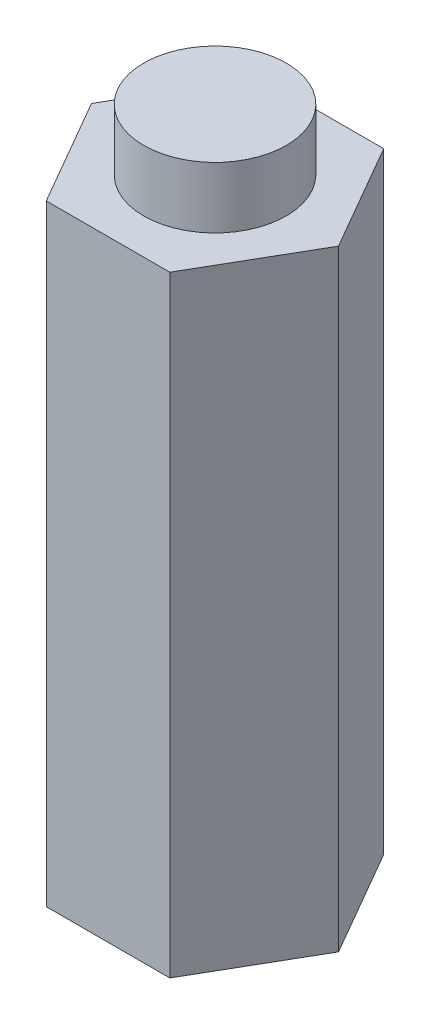
ISO-10303-21;
HEADER;
FILE_DESCRIPTION(('STEP AP214'),'2;1');
FILE_NAME('part.step','',(''),(''),'','','');
FILE_SCHEMA(('AUTOMOTIVE_DESIGN { 1 0 10303 214 1 1 1 1 }'));
ENDSEC;
DATA;
#1=APPLICATION_CONTEXT('core data for automotive mechanical design processes');
#2=APPLICATION_PROTOCOL_DEFINITION('international standard','automotive_design',2000,#1);
#3=PRODUCT_CONTEXT('',#1,'mechanical');
#4=PRODUCT('Part','Part','',(#3));
#5=PRODUCT_RELATED_PRODUCT_CATEGORY('part','',(#4));
#6=PRODUCT_DEFINITION_FORMATION('','',#4);
#7=PRODUCT_DEFINITION_CONTEXT('part definition',#1,'design');
#8=PRODUCT_DEFINITION('design','',#6,#7);
#9=PRODUCT_DEFINITION_SHAPE('','',#8);
#10=(LENGTH_UNIT() NAMED_UNIT(*) SI_UNIT(.MILLI.,.METRE.));
#11=(NAMED_UNIT(*) PLANE_ANGLE_UNIT() SI_UNIT($,.RADIAN.));
#12=(NAMED_UNIT(*) SI_UNIT($,.STERADIAN.) SOLID_ANGLE_UNIT());
#13=UNCERTAINTY_MEASURE_WITH_UNIT(LENGTH_MEASURE(1.E-05),#10,'distance_accuracy_value','');
#14=(GEOMETRIC_REPRESENTATION_CONTEXT(3) GLOBAL_UNCERTAINTY_ASSIGNED_CONTEXT((#13)) GLOBAL_UNIT_ASSIGNED_CONTEXT((#10,
#11,#12)) REPRESENTATION_CONTEXT('',''));
#15=CARTESIAN_POINT('',(0.,0.,0.));
#16=DIRECTION('',(0.,0.,1.));
#17=DIRECTION('',(1.,0.,0.));
#18=AXIS2_PLACEMENT_3D('',#15,#16,#17);
#19=CARTESIAN_POINT('',(0.,60.,0.));
#20=DIRECTION('',(0.,1.,0.));
#21=DIRECTION('',(0.,0.,1.));
#22=AXIS2_PLACEMENT_3D('',#19,#20,#21);
#23=PLANE('',#22);
#24=DIRECTION('',(0.499999999999995,0.,-0.866025403784441));
#25=VECTOR('',#24,1.);
#26=CARTESIAN_POINT('',(6.06217782649116,60.,10.4999999999999));
#27=LINE('',#26,#25);
#28=CARTESIAN_POINT('',(6.06217782649116,60.,10.4999999999999));
#29=VERTEX_POINT('',#28);
#30=CARTESIAN_POINT('',(12.1243556529821,60.,0.));
#31=VERTEX_POINT('',#30);
#32=EDGE_CURVE('E133',#29,#31,#27,.T.);
#33=ORIENTED_EDGE('',*,*,#32,.T.);
#34=DIRECTION('',(-0.500000000000001,0.,-0.866025403784438));
#35=VECTOR('',#34,1.);
#36=CARTESIAN_POINT('',(12.1243556529821,60.,0.));
#37=LINE('',#36,#35);
#38=CARTESIAN_POINT('',(6.06217782649102,60.,-10.5));
#39=VERTEX_POINT('',#38);
#40=EDGE_CURVE('E91',#31,#39,#37,.T.);
#41=ORIENTED_EDGE('',*,*,#40,.T.);
#42=DIRECTION('',(-1.,0.,0.));
#43=VECTOR('',#42,1.);
#44=CARTESIAN_POINT('',(6.06217782649102,60.,-10.5));
#45=LINE('',#44,#43);
#46=CARTESIAN_POINT('',(-6.06217782649109,60.,-10.4999999999999));
#47=VERTEX_POINT('',#46);
#48=EDGE_CURVE('E106',#39,#47,#45,.T.);
#49=ORIENTED_EDGE('',*,*,#48,.T.);
#50=DIRECTION('',(-0.499999999999995,0.,0.866025403784442));
#51=VECTOR('',#50,1.);
#52=CARTESIAN_POINT('',(-6.06217782649109,60.,-10.4999999999999));
#53=LINE('',#52,#51);
#54=CARTESIAN_POINT('',(-12.1243556529821,60.,0.));
#55=VERTEX_POINT('',#54);
#56=EDGE_CURVE('E99',#47,#55,#53,.T.);
#57=ORIENTED_EDGE('',*,*,#56,.T.);
#58=DIRECTION('',(0.500000000000007,0.,0.866025403784435));
#59=VECTOR('',#58,1.);
#60=CARTESIAN_POINT('',(-12.1243556529821,60.,0.));
#61=LINE('',#60,#59);
#62=CARTESIAN_POINT('',(-6.06217782649094,60.,10.5));
#63=VERTEX_POINT('',#62);
#64=EDGE_CURVE('E102',#55,#63,#61,.T.);
#65=ORIENTED_EDGE('',*,*,#64,.T.);
#66=DIRECTION('',(1.,0.,0.));
#67=VECTOR('',#66,1.);
#68=CARTESIAN_POINT('',(-6.06217782649094,60.,10.5));
#69=LINE('',#68,#67);
#70=EDGE_CURVE('E57',#63,#29,#69,.T.);
#71=ORIENTED_EDGE('',*,*,#70,.T.);
#72=EDGE_LOOP('',(#33,#41,#49,#57,#65,#71));
#73=FACE_BOUND('',#72,.T.);
#74=CARTESIAN_POINT('',(0.,60.,0.));
#75=DIRECTION('',(0.,1.,0.));
#76=DIRECTION('',(0.,0.,1.));
#77=AXIS2_PLACEMENT_3D('',#74,#75,#76);
#78=CIRCLE('',#77,7.);
#79=CARTESIAN_POINT('',(0.,60.,7.));
#80=VERTEX_POINT('',#79);
#81=EDGE_CURVE('E126',#80,#80,#78,.T.);
#82=ORIENTED_EDGE('',*,*,#81,.F.);
#83=EDGE_LOOP('',(#82));
#84=FACE_BOUND('',#83,.T.);
#85=ADVANCED_FACE('F39',(#73,#84),#23,.T.);
#86=CARTESIAN_POINT('',(0.,0.,0.));
#87=DIRECTION('',(0.,1.,0.));
#88=DIRECTION('',(0.,0.,1.));
#89=AXIS2_PLACEMENT_3D('',#86,#87,#88);
#90=PLANE('',#89);
#91=DIRECTION('',(0.499999999999995,0.,-0.866025403784441));
#92=VECTOR('',#91,1.);
#93=CARTESIAN_POINT('',(6.06217782649116,0.,10.4999999999999));
#94=LINE('',#93,#92);
#95=CARTESIAN_POINT('',(6.06217782649116,0.,10.4999999999999));
#96=VERTEX_POINT('',#95);
#97=CARTESIAN_POINT('',(12.1243556529821,0.,0.));
#98=VERTEX_POINT('',#97);
#99=EDGE_CURVE('E122',#96,#98,#94,.T.);
#100=ORIENTED_EDGE('',*,*,#99,.F.);
#101=DIRECTION('',(1.,0.,0.));
#102=VECTOR('',#101,1.);
#103=CARTESIAN_POINT('',(-6.06217782649094,0.,10.5));
#104=LINE('',#103,#102);
#105=CARTESIAN_POINT('',(-6.06217782649094,0.,10.5));
#106=VERTEX_POINT('',#105);
#107=EDGE_CURVE('E84',#106,#96,#104,.T.);
#108=ORIENTED_EDGE('',*,*,#107,.F.);
#109=DIRECTION('',(0.500000000000007,0.,0.866025403784435));
#110=VECTOR('',#109,1.);
#111=CARTESIAN_POINT('',(-12.1243556529821,0.,0.));
#112=LINE('',#111,#110);
#113=CARTESIAN_POINT('',(-12.1243556529821,0.,0.));
#114=VERTEX_POINT('',#113);
#115=EDGE_CURVE('E76',#114,#106,#112,.T.);
#116=ORIENTED_EDGE('',*,*,#115,.F.);
#117=DIRECTION('',(-0.499999999999995,0.,0.866025403784442));
#118=VECTOR('',#117,1.);
#119=CARTESIAN_POINT('',(-6.06217782649109,0.,-10.4999999999999));
#120=LINE('',#119,#118);
#121=CARTESIAN_POINT('',(-6.06217782649109,0.,-10.4999999999999));
#122=VERTEX_POINT('',#121);
#123=EDGE_CURVE('E111',#122,#114,#120,.T.);
#124=ORIENTED_EDGE('',*,*,#123,.F.);
#125=DIRECTION('',(-1.,0.,0.));
#126=VECTOR('',#125,1.);
#127=CARTESIAN_POINT('',(6.06217782649102,0.,-10.5));
#128=LINE('',#127,#126);
#129=CARTESIAN_POINT('',(6.06217782649102,0.,-10.5));
#130=VERTEX_POINT('',#129);
#131=EDGE_CURVE('E128',#130,#122,#128,.T.);
#132=ORIENTED_EDGE('',*,*,#131,.F.);
#133=DIRECTION('',(-0.500000000000001,0.,-0.866025403784438));
#134=VECTOR('',#133,1.);
#135=CARTESIAN_POINT('',(12.1243556529821,0.,0.));
#136=LINE('',#135,#134);
#137=EDGE_CURVE('E130',#98,#130,#136,.T.);
#138=ORIENTED_EDGE('',*,*,#137,.F.);
#139=EDGE_LOOP('',(#100,#108,#116,#124,#132,#138));
#140=FACE_BOUND('',#139,.T.);
#141=ADVANCED_FACE('F145',(#140),#90,.F.);
#142=CARTESIAN_POINT('',(6.06217782649116,60.,10.4999999999999));
#143=DIRECTION('',(-0.866025403784441,0.,-0.499999999999995));
#144=DIRECTION('',(-0.499999999999995,0.,0.866025403784442));
#145=AXIS2_PLACEMENT_3D('',#142,#143,#144);
#146=PLANE('',#145);
#147=ORIENTED_EDGE('',*,*,#99,.T.);
#148=DIRECTION('',(0.,-1.,0.));
#149=VECTOR('',#148,1.);
#150=CARTESIAN_POINT('',(12.1243556529821,60.,0.));
#151=LINE('',#150,#149);
#152=EDGE_CURVE('E11',#31,#98,#151,.T.);
#153=ORIENTED_EDGE('',*,*,#152,.F.);
#154=ORIENTED_EDGE('',*,*,#32,.F.);
#155=DIRECTION('',(0.,-1.,0.));
#156=VECTOR('',#155,1.);
#157=CARTESIAN_POINT('',(6.06217782649116,60.,10.4999999999999));
#158=LINE('',#157,#156);
#159=EDGE_CURVE('E118',#29,#96,#158,.T.);
#160=ORIENTED_EDGE('',*,*,#159,.T.);
#161=EDGE_LOOP('',(#147,#153,#154,#160));
#162=FACE_BOUND('',#161,.T.);
#163=ADVANCED_FACE('F41',(#162),#146,.F.);
#164=CARTESIAN_POINT('',(12.1243556529821,60.,0.));
#165=DIRECTION('',(-0.866025403784438,0.,0.500000000000001));
#166=DIRECTION('',(0.500000000000001,0.,0.866025403784438));
#167=AXIS2_PLACEMENT_3D('',#164,#165,#166);
#168=PLANE('',#167);
#169=ORIENTED_EDGE('',*,*,#137,.T.);
#170=DIRECTION('',(0.,-1.,0.));
#171=VECTOR('',#170,1.);
#172=CARTESIAN_POINT('',(6.06217782649102,60.,-10.5));
#173=LINE('',#172,#171);
#174=EDGE_CURVE('E48',#39,#130,#173,.T.);
#175=ORIENTED_EDGE('',*,*,#174,.F.);
#176=ORIENTED_EDGE('',*,*,#40,.F.);
#177=ORIENTED_EDGE('',*,*,#152,.T.);
#178=EDGE_LOOP('',(#169,#175,#176,#177));
#179=FACE_BOUND('',#178,.T.);
#180=ADVANCED_FACE('F224',(#179),#168,.F.);
#181=CARTESIAN_POINT('',(6.06217782649102,60.,-10.5));
#182=DIRECTION('',(0.,0.,1.));
#183=DIRECTION('',(1.,0.,0.));
#184=AXIS2_PLACEMENT_3D('',#181,#182,#183);
#185=PLANE('',#184);
#186=ORIENTED_EDGE('',*,*,#131,.T.);
#187=DIRECTION('',(0.,-1.,0.));
#188=VECTOR('',#187,1.);
#189=CARTESIAN_POINT('',(-6.06217782649109,60.,-10.4999999999999));
#190=LINE('',#189,#188);
#191=EDGE_CURVE('E113',#47,#122,#190,.T.);
#192=ORIENTED_EDGE('',*,*,#191,.F.);
#193=ORIENTED_EDGE('',*,*,#48,.F.);
#194=ORIENTED_EDGE('',*,*,#174,.T.);
#195=EDGE_LOOP('',(#186,#192,#193,#194));
#196=FACE_BOUND('',#195,.T.);
#197=ADVANCED_FACE('F143',(#196),#185,.F.);
#198=CARTESIAN_POINT('',(-6.06217782649109,60.,-10.4999999999999));
#199=DIRECTION('',(0.866025403784441,0.,0.499999999999995));
#200=DIRECTION('',(0.499999999999995,0.,-0.866025403784442));
#201=AXIS2_PLACEMENT_3D('',#198,#199,#200);
#202=PLANE('',#201);
#203=ORIENTED_EDGE('',*,*,#123,.T.);
#204=DIRECTION('',(0.,-1.,0.));
#205=VECTOR('',#204,1.);
#206=CARTESIAN_POINT('',(-12.1243556529821,60.,0.));
#207=LINE('',#206,#205);
#208=EDGE_CURVE('E112',#55,#114,#207,.T.);
#209=ORIENTED_EDGE('',*,*,#208,.F.);
#210=ORIENTED_EDGE('',*,*,#56,.F.);
#211=ORIENTED_EDGE('',*,*,#191,.T.);
#212=EDGE_LOOP('',(#203,#209,#210,#211));
#213=FACE_BOUND('',#212,.T.);
#214=ADVANCED_FACE('F115',(#213),#202,.F.);
#215=CARTESIAN_POINT('',(-12.1243556529821,60.,0.));
#216=DIRECTION('',(0.866025403784434,0.,-0.500000000000007));
#217=DIRECTION('',(-0.500000000000007,0.,-0.866025403784435));
#218=AXIS2_PLACEMENT_3D('',#215,#216,#217);
#219=PLANE('',#218);
#220=ORIENTED_EDGE('',*,*,#115,.T.);
#221=DIRECTION('',(0.,-1.,0.));
#222=VECTOR('',#221,1.);
#223=CARTESIAN_POINT('',(-6.06217782649094,60.,10.5));
#224=LINE('',#223,#222);
#225=EDGE_CURVE('E117',#63,#106,#224,.T.);
#226=ORIENTED_EDGE('',*,*,#225,.F.);
#227=ORIENTED_EDGE('',*,*,#64,.F.);
#228=ORIENTED_EDGE('',*,*,#208,.T.);
#229=EDGE_LOOP('',(#220,#226,#227,#228));
#230=FACE_BOUND('',#229,.T.);
#231=ADVANCED_FACE('F119',(#230),#219,.F.);
#232=CARTESIAN_POINT('',(-6.06217782649094,60.,10.5));
#233=DIRECTION('',(0.,0.,-1.));
#234=DIRECTION('',(-1.,0.,0.));
#235=AXIS2_PLACEMENT_3D('',#232,#233,#234);
#236=PLANE('',#235);
#237=ORIENTED_EDGE('',*,*,#107,.T.);
#238=ORIENTED_EDGE('',*,*,#159,.F.);
#239=ORIENTED_EDGE('',*,*,#70,.F.);
#240=ORIENTED_EDGE('',*,*,#225,.T.);
#241=EDGE_LOOP('',(#237,#238,#239,#240));
#242=FACE_BOUND('',#241,.T.);
#243=ADVANCED_FACE('F146',(#242),#236,.F.);
#244=CARTESIAN_POINT('',(0.,66.,0.));
#245=DIRECTION('',(0.,-1.,0.));
#246=DIRECTION('',(0.,0.,-1.));
#247=AXIS2_PLACEMENT_3D('',#244,#245,#246);
#248=CYLINDRICAL_SURFACE('',#247,7.);
#249=ORIENTED_EDGE('',*,*,#81,.T.);
#250=EDGE_LOOP('',(#249));
#251=FACE_BOUND('',#250,.T.);
#252=CARTESIAN_POINT('',(0.,66.,0.));
#253=DIRECTION('',(0.,1.,0.));
#254=DIRECTION('',(0.,0.,1.));
#255=AXIS2_PLACEMENT_3D('',#252,#253,#254);
#256=CIRCLE('',#255,7.);
#257=CARTESIAN_POINT('',(0.,66.,7.));
#258=VERTEX_POINT('',#257);
#259=EDGE_CURVE('E171',#258,#258,#256,.T.);
#260=ORIENTED_EDGE('',*,*,#259,.F.);
#261=EDGE_LOOP('',(#260));
#262=FACE_BOUND('',#261,.T.);
#263=ADVANCED_FACE('F147',(#251,#262),#248,.T.);
#264=CARTESIAN_POINT('',(0.,66.,0.));
#265=DIRECTION('',(0.,1.,0.));
#266=DIRECTION('',(0.,0.,1.));
#267=AXIS2_PLACEMENT_3D('',#264,#265,#266);
#268=PLANE('',#267);
#269=ORIENTED_EDGE('',*,*,#259,.T.);
#270=EDGE_LOOP('',(#269));
#271=FACE_BOUND('',#270,.T.);
#272=ADVANCED_FACE('F160',(#271),#268,.T.);
#273=CLOSED_SHELL('',(#85,#141,#163,#180,#197,#214,#231,#243,#263,#272));
#274=MANIFOLD_SOLID_BREP('B2',#273);
#275=ADVANCED_BREP_SHAPE_REPRESENTATION('',(#18,#274),#14);
#276=SHAPE_DEFINITION_REPRESENTATION(#9,#275);
ENDSEC;
END-ISO-10303-21;
